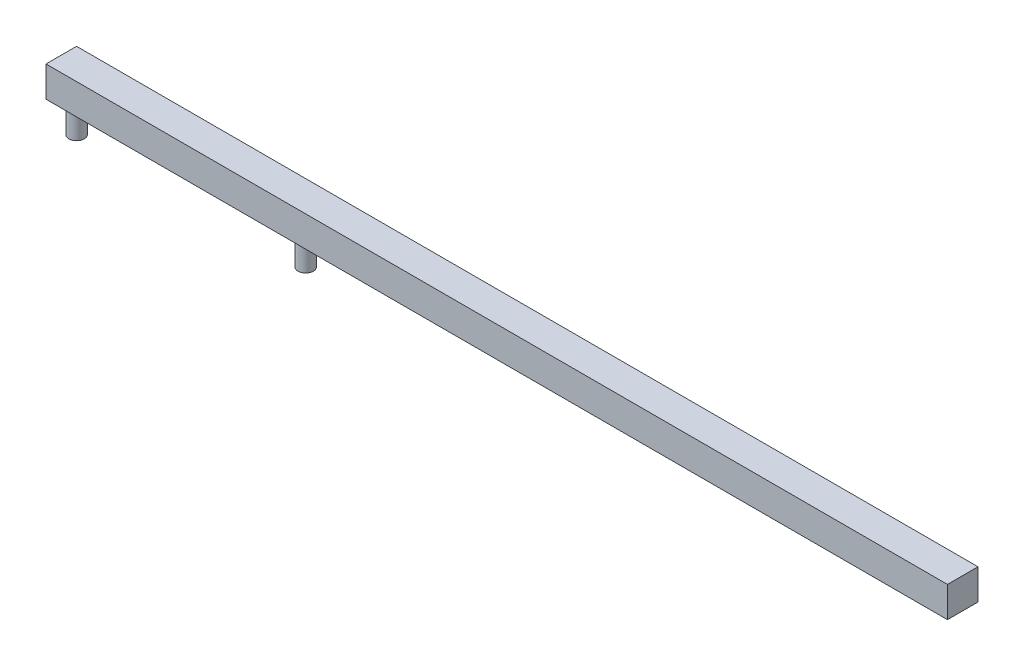
ISO-10303-21;
HEADER;
FILE_DESCRIPTION(('STEP AP214'),'2;1');
FILE_NAME('part.step','',(''),(''),'','','');
FILE_SCHEMA(('AUTOMOTIVE_DESIGN { 1 0 10303 214 1 1 1 1 }'));
ENDSEC;
DATA;
#1=APPLICATION_CONTEXT('core data for automotive mechanical design processes');
#2=APPLICATION_PROTOCOL_DEFINITION('international standard','automotive_design',2000,#1);
#3=PRODUCT_CONTEXT('',#1,'mechanical');
#4=PRODUCT('Part','Part','',(#3));
#5=PRODUCT_RELATED_PRODUCT_CATEGORY('part','',(#4));
#6=PRODUCT_DEFINITION_FORMATION('','',#4);
#7=PRODUCT_DEFINITION_CONTEXT('part definition',#1,'design');
#8=PRODUCT_DEFINITION('design','',#6,#7);
#9=PRODUCT_DEFINITION_SHAPE('','',#8);
#10=(LENGTH_UNIT() NAMED_UNIT(*) SI_UNIT(.MILLI.,.METRE.));
#11=(NAMED_UNIT(*) PLANE_ANGLE_UNIT() SI_UNIT($,.RADIAN.));
#12=(NAMED_UNIT(*) SI_UNIT($,.STERADIAN.) SOLID_ANGLE_UNIT());
#13=UNCERTAINTY_MEASURE_WITH_UNIT(LENGTH_MEASURE(1.E-05),#10,'distance_accuracy_value','');
#14=(GEOMETRIC_REPRESENTATION_CONTEXT(3) GLOBAL_UNCERTAINTY_ASSIGNED_CONTEXT((#13)) GLOBAL_UNIT_ASSIGNED_CONTEXT((#10,
#11,#12)) REPRESENTATION_CONTEXT('',''));
#15=CARTESIAN_POINT('',(0.,0.,0.));
#16=DIRECTION('',(0.,0.,1.));
#17=DIRECTION('',(1.,0.,0.));
#18=AXIS2_PLACEMENT_3D('',#15,#16,#17);
#19=CARTESIAN_POINT('',(0.,10.,0.));
#20=DIRECTION('',(-1.,0.,0.));
#21=DIRECTION('',(0.,0.,1.));
#22=AXIS2_PLACEMENT_3D('',#19,#20,#21);
#23=PLANE('',#22);
#24=DIRECTION('',(0.,0.,-1.));
#25=VECTOR('',#24,1.);
#26=CARTESIAN_POINT('',(0.,0.,0.));
#27=LINE('',#26,#25);
#28=CARTESIAN_POINT('',(0.,0.,10.));
#29=VERTEX_POINT('',#28);
#30=CARTESIAN_POINT('',(0.,0.,0.));
#31=VERTEX_POINT('',#30);
#32=EDGE_CURVE('E97',#29,#31,#27,.T.);
#33=ORIENTED_EDGE('',*,*,#32,.T.);
#34=DIRECTION('',(0.,-1.,0.));
#35=VECTOR('',#34,1.);
#36=CARTESIAN_POINT('',(0.,10.,0.));
#37=LINE('',#36,#35);
#38=CARTESIAN_POINT('',(0.,10.,0.));
#39=VERTEX_POINT('',#38);
#40=EDGE_CURVE('E11',#39,#31,#37,.T.);
#41=ORIENTED_EDGE('',*,*,#40,.F.);
#42=DIRECTION('',(0.,0.,-1.));
#43=VECTOR('',#42,1.);
#44=CARTESIAN_POINT('',(0.,10.,0.));
#45=LINE('',#44,#43);
#46=CARTESIAN_POINT('',(0.,10.,10.));
#47=VERTEX_POINT('',#46);
#48=EDGE_CURVE('E85',#47,#39,#45,.T.);
#49=ORIENTED_EDGE('',*,*,#48,.F.);
#50=DIRECTION('',(0.,-1.,0.));
#51=VECTOR('',#50,1.);
#52=CARTESIAN_POINT('',(0.,10.,10.));
#53=LINE('',#52,#51);
#54=EDGE_CURVE('E93',#47,#29,#53,.T.);
#55=ORIENTED_EDGE('',*,*,#54,.T.);
#56=EDGE_LOOP('',(#33,#41,#49,#55));
#57=FACE_BOUND('',#56,.T.);
#58=ADVANCED_FACE('F34',(#57),#23,.F.);
#59=CARTESIAN_POINT('',(0.,10.,0.));
#60=DIRECTION('',(0.,0.,1.));
#61=DIRECTION('',(1.,0.,0.));
#62=AXIS2_PLACEMENT_3D('',#59,#60,#61);
#63=PLANE('',#62);
#64=DIRECTION('',(-1.,0.,0.));
#65=VECTOR('',#64,1.);
#66=CARTESIAN_POINT('',(0.,0.,0.));
#67=LINE('',#66,#65);
#68=CARTESIAN_POINT('',(-295.,0.,0.));
#69=VERTEX_POINT('',#68);
#70=EDGE_CURVE('E89',#31,#69,#67,.T.);
#71=ORIENTED_EDGE('',*,*,#70,.T.);
#72=DIRECTION('',(0.,-1.,0.));
#73=VECTOR('',#72,1.);
#74=CARTESIAN_POINT('',(-295.,10.,0.));
#75=LINE('',#74,#73);
#76=CARTESIAN_POINT('',(-295.,10.,0.));
#77=VERTEX_POINT('',#76);
#78=EDGE_CURVE('E42',#77,#69,#75,.T.);
#79=ORIENTED_EDGE('',*,*,#78,.F.);
#80=DIRECTION('',(-1.,0.,0.));
#81=VECTOR('',#80,1.);
#82=CARTESIAN_POINT('',(0.,10.,0.));
#83=LINE('',#82,#81);
#84=EDGE_CURVE('E80',#39,#77,#83,.T.);
#85=ORIENTED_EDGE('',*,*,#84,.F.);
#86=ORIENTED_EDGE('',*,*,#40,.T.);
#87=EDGE_LOOP('',(#71,#79,#85,#86));
#88=FACE_BOUND('',#87,.T.);
#89=ADVANCED_FACE('F88',(#88),#63,.F.);
#90=CARTESIAN_POINT('',(-295.,10.,0.));
#91=DIRECTION('',(1.,0.,0.));
#92=DIRECTION('',(0.,0.,-1.));
#93=AXIS2_PLACEMENT_3D('',#90,#91,#92);
#94=PLANE('',#93);
#95=DIRECTION('',(0.,0.,1.));
#96=VECTOR('',#95,1.);
#97=CARTESIAN_POINT('',(-295.,0.,0.));
#98=LINE('',#97,#96);
#99=CARTESIAN_POINT('',(-295.,0.,10.));
#100=VERTEX_POINT('',#99);
#101=EDGE_CURVE('E67',#69,#100,#98,.T.);
#102=ORIENTED_EDGE('',*,*,#101,.T.);
#103=DIRECTION('',(0.,-1.,0.));
#104=VECTOR('',#103,1.);
#105=CARTESIAN_POINT('',(-295.,10.,10.));
#106=LINE('',#105,#104);
#107=CARTESIAN_POINT('',(-295.,10.,10.));
#108=VERTEX_POINT('',#107);
#109=EDGE_CURVE('E90',#108,#100,#106,.T.);
#110=ORIENTED_EDGE('',*,*,#109,.F.);
#111=DIRECTION('',(0.,0.,1.));
#112=VECTOR('',#111,1.);
#113=CARTESIAN_POINT('',(-295.,10.,0.));
#114=LINE('',#113,#112);
#115=EDGE_CURVE('E83',#77,#108,#114,.T.);
#116=ORIENTED_EDGE('',*,*,#115,.F.);
#117=ORIENTED_EDGE('',*,*,#78,.T.);
#118=EDGE_LOOP('',(#102,#110,#116,#117));
#119=FACE_BOUND('',#118,.T.);
#120=ADVANCED_FACE('F91',(#119),#94,.F.);
#121=CARTESIAN_POINT('',(0.,10.,10.));
#122=DIRECTION('',(0.,0.,-1.));
#123=DIRECTION('',(-1.,0.,0.));
#124=AXIS2_PLACEMENT_3D('',#121,#122,#123);
#125=PLANE('',#124);
#126=DIRECTION('',(1.,0.,0.));
#127=VECTOR('',#126,1.);
#128=CARTESIAN_POINT('',(0.,0.,10.));
#129=LINE('',#128,#127);
#130=EDGE_CURVE('E73',#100,#29,#129,.T.);
#131=ORIENTED_EDGE('',*,*,#130,.T.);
#132=ORIENTED_EDGE('',*,*,#54,.F.);
#133=DIRECTION('',(1.,0.,0.));
#134=VECTOR('',#133,1.);
#135=CARTESIAN_POINT('',(0.,10.,10.));
#136=LINE('',#135,#134);
#137=EDGE_CURVE('E50',#108,#47,#136,.T.);
#138=ORIENTED_EDGE('',*,*,#137,.F.);
#139=ORIENTED_EDGE('',*,*,#109,.T.);
#140=EDGE_LOOP('',(#131,#132,#138,#139));
#141=FACE_BOUND('',#140,.T.);
#142=ADVANCED_FACE('F105',(#141),#125,.F.);
#143=CARTESIAN_POINT('',(0.,10.,0.));
#144=DIRECTION('',(0.,-1.,0.));
#145=DIRECTION('',(0.,0.,-1.));
#146=AXIS2_PLACEMENT_3D('',#143,#144,#145);
#147=PLANE('',#146);
#148=ORIENTED_EDGE('',*,*,#48,.T.);
#149=ORIENTED_EDGE('',*,*,#84,.T.);
#150=ORIENTED_EDGE('',*,*,#115,.T.);
#151=ORIENTED_EDGE('',*,*,#137,.T.);
#152=EDGE_LOOP('',(#148,#149,#150,#151));
#153=FACE_BOUND('',#152,.T.);
#154=ADVANCED_FACE('F81',(#153),#147,.F.);
#155=CARTESIAN_POINT('',(0.,0.,0.));
#156=DIRECTION('',(0.,-1.,0.));
#157=DIRECTION('',(0.,0.,-1.));
#158=AXIS2_PLACEMENT_3D('',#155,#156,#157);
#159=PLANE('',#158);
#160=CARTESIAN_POINT('',(-215.,0.,5.00000000000003));
#161=DIRECTION('',(0.,-1.,0.));
#162=DIRECTION('',(0.,0.,-1.));
#163=AXIS2_PLACEMENT_3D('',#160,#161,#162);
#164=CIRCLE('',#163,2.5);
#165=CARTESIAN_POINT('',(-215.,0.,2.50000000000003));
#166=VERTEX_POINT('',#165);
#167=EDGE_CURVE('E117',#166,#166,#164,.T.);
#168=ORIENTED_EDGE('',*,*,#167,.F.);
#169=EDGE_LOOP('',(#168));
#170=FACE_BOUND('',#169,.T.);
#171=CARTESIAN_POINT('',(-290.,0.,5.00000000000002));
#172=DIRECTION('',(0.,-1.,0.));
#173=DIRECTION('',(0.,0.,-1.));
#174=AXIS2_PLACEMENT_3D('',#171,#172,#173);
#175=CIRCLE('',#174,2.50000000000002);
#176=CARTESIAN_POINT('',(-290.,0.,2.5));
#177=VERTEX_POINT('',#176);
#178=EDGE_CURVE('E111',#177,#177,#175,.T.);
#179=ORIENTED_EDGE('',*,*,#178,.F.);
#180=EDGE_LOOP('',(#179));
#181=FACE_BOUND('',#180,.T.);
#182=ORIENTED_EDGE('',*,*,#32,.F.);
#183=ORIENTED_EDGE('',*,*,#130,.F.);
#184=ORIENTED_EDGE('',*,*,#101,.F.);
#185=ORIENTED_EDGE('',*,*,#70,.F.);
#186=EDGE_LOOP('',(#182,#183,#184,#185));
#187=FACE_BOUND('',#186,.T.);
#188=ADVANCED_FACE('F108',(#170,#181,#187),#159,.T.);
#189=CARTESIAN_POINT('',(-290.,-10.,5.00000000000002));
#190=DIRECTION('',(0.,1.,0.));
#191=DIRECTION('',(0.,0.,1.));
#192=AXIS2_PLACEMENT_3D('',#189,#190,#191);
#193=CYLINDRICAL_SURFACE('',#192,2.50000000000002);
#194=CARTESIAN_POINT('',(-290.,-10.,5.00000000000002));
#195=DIRECTION('',(0.,-1.,0.));
#196=DIRECTION('',(0.,0.,-1.));
#197=AXIS2_PLACEMENT_3D('',#194,#195,#196);
#198=CIRCLE('',#197,2.50000000000002);
#199=CARTESIAN_POINT('',(-290.,-10.,2.5));
#200=VERTEX_POINT('',#199);
#201=EDGE_CURVE('E100',#200,#200,#198,.T.);
#202=ORIENTED_EDGE('',*,*,#201,.F.);
#203=EDGE_LOOP('',(#202));
#204=FACE_BOUND('',#203,.T.);
#205=ORIENTED_EDGE('',*,*,#178,.T.);
#206=EDGE_LOOP('',(#205));
#207=FACE_BOUND('',#206,.T.);
#208=ADVANCED_FACE('F134',(#204,#207),#193,.T.);
#209=CARTESIAN_POINT('',(-290.,-10.,5.00000000000002));
#210=DIRECTION('',(0.,-1.,0.));
#211=DIRECTION('',(0.,0.,-1.));
#212=AXIS2_PLACEMENT_3D('',#209,#210,#211);
#213=PLANE('',#212);
#214=ORIENTED_EDGE('',*,*,#201,.T.);
#215=EDGE_LOOP('',(#214));
#216=FACE_BOUND('',#215,.T.);
#217=ADVANCED_FACE('F128',(#216),#213,.T.);
#218=CARTESIAN_POINT('',(-215.,-10.,5.00000000000003));
#219=DIRECTION('',(0.,1.,0.));
#220=DIRECTION('',(0.,0.,1.));
#221=AXIS2_PLACEMENT_3D('',#218,#219,#220);
#222=CYLINDRICAL_SURFACE('',#221,2.5);
#223=CARTESIAN_POINT('',(-215.,-10.,5.00000000000003));
#224=DIRECTION('',(0.,-1.,0.));
#225=DIRECTION('',(0.,0.,-1.));
#226=AXIS2_PLACEMENT_3D('',#223,#224,#225);
#227=CIRCLE('',#226,2.5);
#228=CARTESIAN_POINT('',(-215.,-10.,2.50000000000003));
#229=VERTEX_POINT('',#228);
#230=EDGE_CURVE('E114',#229,#229,#227,.T.);
#231=ORIENTED_EDGE('',*,*,#230,.F.);
#232=EDGE_LOOP('',(#231));
#233=FACE_BOUND('',#232,.T.);
#234=ORIENTED_EDGE('',*,*,#167,.T.);
#235=EDGE_LOOP('',(#234));
#236=FACE_BOUND('',#235,.T.);
#237=ADVANCED_FACE('F125',(#233,#236),#222,.T.);
#238=CARTESIAN_POINT('',(-215.,-10.,5.00000000000003));
#239=DIRECTION('',(0.,-1.,0.));
#240=DIRECTION('',(0.,0.,-1.));
#241=AXIS2_PLACEMENT_3D('',#238,#239,#240);
#242=PLANE('',#241);
#243=ORIENTED_EDGE('',*,*,#230,.T.);
#244=EDGE_LOOP('',(#243));
#245=FACE_BOUND('',#244,.T.);
#246=ADVANCED_FACE('F123',(#245),#242,.T.);
#247=CLOSED_SHELL('',(#58,#89,#120,#142,#154,#188,#208,#217,#237,#246));
#248=MANIFOLD_SOLID_BREP('B2',#247);
#249=ADVANCED_BREP_SHAPE_REPRESENTATION('',(#18,#248),#14);
#250=SHAPE_DEFINITION_REPRESENTATION(#9,#249);
ENDSEC;
END-ISO-10303-21;
